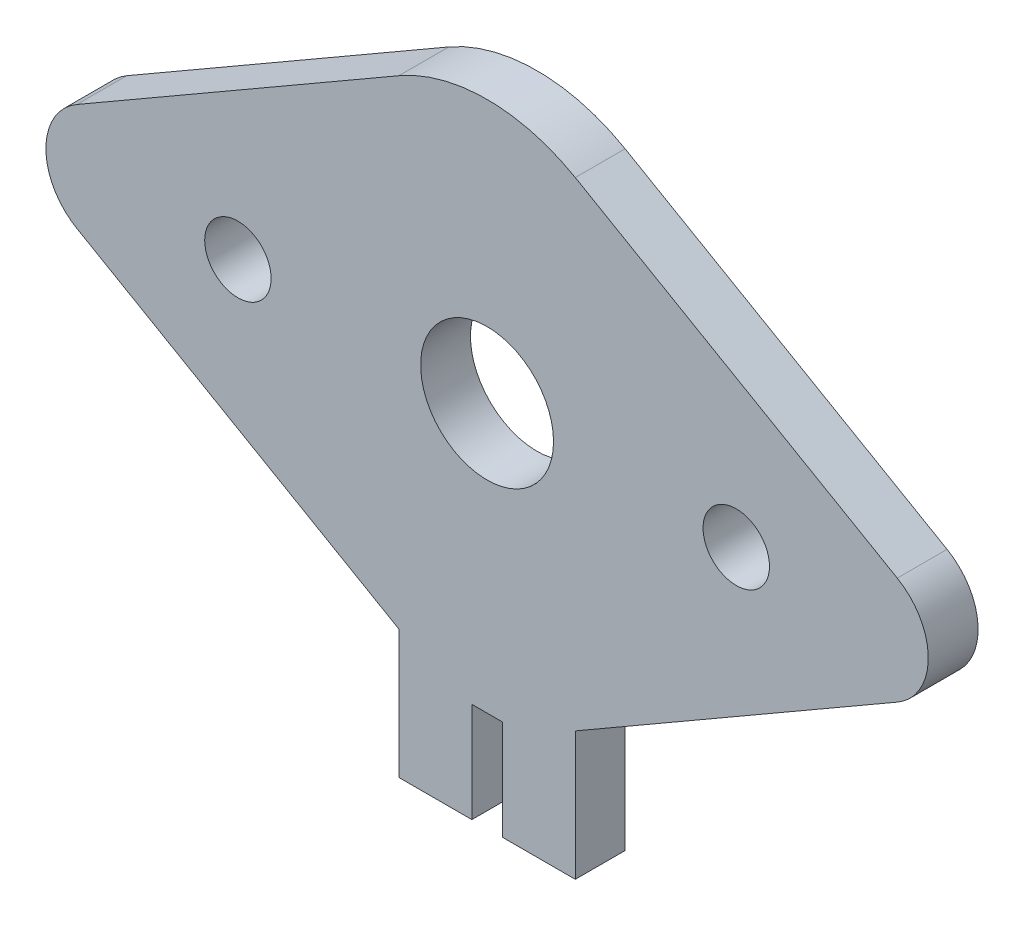
ISO-10303-21;
HEADER;
FILE_DESCRIPTION(('STEP AP214'),'2;1');
FILE_NAME('part.step','',(''),(''),'','','');
FILE_SCHEMA(('AUTOMOTIVE_DESIGN { 1 0 10303 214 1 1 1 1 }'));
ENDSEC;
DATA;
#1=APPLICATION_CONTEXT('core data for automotive mechanical design processes');
#2=APPLICATION_PROTOCOL_DEFINITION('international standard','automotive_design',2000,#1);
#3=PRODUCT_CONTEXT('',#1,'mechanical');
#4=PRODUCT('Part','Part','',(#3));
#5=PRODUCT_RELATED_PRODUCT_CATEGORY('part','',(#4));
#6=PRODUCT_DEFINITION_FORMATION('','',#4);
#7=PRODUCT_DEFINITION_CONTEXT('part definition',#1,'design');
#8=PRODUCT_DEFINITION('design','',#6,#7);
#9=PRODUCT_DEFINITION_SHAPE('','',#8);
#10=(LENGTH_UNIT() NAMED_UNIT(*) SI_UNIT(.MILLI.,.METRE.));
#11=(NAMED_UNIT(*) PLANE_ANGLE_UNIT() SI_UNIT($,.RADIAN.));
#12=(NAMED_UNIT(*) SI_UNIT($,.STERADIAN.) SOLID_ANGLE_UNIT());
#13=UNCERTAINTY_MEASURE_WITH_UNIT(LENGTH_MEASURE(1.E-05),#10,'distance_accuracy_value','');
#14=(GEOMETRIC_REPRESENTATION_CONTEXT(3) GLOBAL_UNCERTAINTY_ASSIGNED_CONTEXT((#13)) GLOBAL_UNIT_ASSIGNED_CONTEXT((#10,
#11,#12)) REPRESENTATION_CONTEXT('',''));
#15=CARTESIAN_POINT('',(0.,0.,0.));
#16=DIRECTION('',(0.,0.,1.));
#17=DIRECTION('',(1.,0.,0.));
#18=AXIS2_PLACEMENT_3D('',#15,#16,#17);
#19=CARTESIAN_POINT('',(3.49113099540332E-12,5.22821843689879,3.));
#20=DIRECTION('',(0.,0.,-1.));
#21=DIRECTION('',(-1.,0.,0.));
#22=AXIS2_PLACEMENT_3D('',#19,#20,#21);
#23=PLANE('',#22);
#24=CARTESIAN_POINT('',(-15.,0.,3.));
#25=DIRECTION('',(0.,0.,-1.));
#26=DIRECTION('',(-1.,0.,0.));
#27=AXIS2_PLACEMENT_3D('',#24,#25,#26);
#28=CIRCLE('',#27,2.00000000000001);
#29=CARTESIAN_POINT('',(-17.,0.,3.));
#30=VERTEX_POINT('',#29);
#31=EDGE_CURVE('E309',#30,#30,#28,.T.);
#32=ORIENTED_EDGE('',*,*,#31,.T.);
#33=EDGE_LOOP('',(#32));
#34=FACE_BOUND('',#33,.T.);
#35=CARTESIAN_POINT('',(3.49113099540332E-12,5.22821843689879,3.));
#36=DIRECTION('',(0.,0.,-1.));
#37=DIRECTION('',(-1.,0.,0.));
#38=AXIS2_PLACEMENT_3D('',#35,#36,#37);
#39=CIRCLE('',#38,10.6185335114162);
#40=CARTESIAN_POINT('',(-5.30926675570459,14.4241382087216,3.));
#41=VERTEX_POINT('',#40);
#42=CARTESIAN_POINT('',(5.30926675571157,14.4241382087216,3.));
#43=VERTEX_POINT('',#42);
#44=EDGE_CURVE('E339',#41,#43,#39,.T.);
#45=ORIENTED_EDGE('',*,*,#44,.F.);
#46=DIRECTION('',(-0.866025403784438,-0.500000000000001,0.));
#47=VECTOR('',#46,1.);
#48=CARTESIAN_POINT('',(-5.30926675570459,14.4241382087216,3.));
#49=LINE('',#48,#47);
#50=CARTESIAN_POINT('',(-24.6931145790386,3.2328684499889,3.));
#51=VERTEX_POINT('',#50);
#52=EDGE_CURVE('E283',#41,#51,#49,.T.);
#53=ORIENTED_EDGE('',*,*,#52,.T.);
#54=CARTESIAN_POINT('',(-22.8266171091828,0.,3.));
#55=DIRECTION('',(0.,0.,1.));
#56=DIRECTION('',(1.,0.,0.));
#57=AXIS2_PLACEMENT_3D('',#54,#55,#56);
#58=CIRCLE('',#57,3.73299493971148);
#59=CARTESIAN_POINT('',(-24.6931145790386,-3.2328684499889,3.));
#60=VERTEX_POINT('',#59);
#61=EDGE_CURVE('E277',#51,#60,#58,.T.);
#62=ORIENTED_EDGE('',*,*,#61,.T.);
#63=DIRECTION('',(-0.866025403784438,0.500000000000001,0.));
#64=VECTOR('',#63,1.);
#65=CARTESIAN_POINT('',(-5.30926675570459,-14.4241382087216,3.));
#66=LINE('',#65,#64);
#67=CARTESIAN_POINT('',(-5.30926675570459,-14.4241382087216,3.));
#68=VERTEX_POINT('',#67);
#69=EDGE_CURVE('E282',#68,#60,#66,.T.);
#70=ORIENTED_EDGE('',*,*,#69,.F.);
#71=DIRECTION('',(0.,-1.,0.));
#72=VECTOR('',#71,1.);
#73=CARTESIAN_POINT('',(-5.30926675570459,-14.4241382087216,3.));
#74=LINE('',#73,#72);
#75=CARTESIAN_POINT('',(-5.30926675570459,-22.1621231765141,3.));
#76=VERTEX_POINT('',#75);
#77=EDGE_CURVE('E298',#68,#76,#74,.T.);
#78=ORIENTED_EDGE('',*,*,#77,.T.);
#79=DIRECTION('',(1.,0.,0.));
#80=VECTOR('',#79,1.);
#81=CARTESIAN_POINT('',(-5.30926675570459,-22.1621231765141,3.));
#82=LINE('',#81,#80);
#83=CARTESIAN_POINT('',(-0.916263641319623,-22.1621231765141,3.));
#84=VERTEX_POINT('',#83);
#85=EDGE_CURVE('E300',#76,#84,#82,.T.);
#86=ORIENTED_EDGE('',*,*,#85,.T.);
#87=DIRECTION('',(0.,1.,0.));
#88=VECTOR('',#87,1.);
#89=CARTESIAN_POINT('',(-0.916263641319623,-22.1621231765141,3.));
#90=LINE('',#89,#88);
#91=CARTESIAN_POINT('',(-0.916263641319623,-16.1507515593028,3.));
#92=VERTEX_POINT('',#91);
#93=EDGE_CURVE('E378',#84,#92,#90,.T.);
#94=ORIENTED_EDGE('',*,*,#93,.T.);
#95=DIRECTION('',(1.,0.,0.));
#96=VECTOR('',#95,1.);
#97=CARTESIAN_POINT('',(-0.916263641319623,-16.1507515593028,3.));
#98=LINE('',#97,#96);
#99=CARTESIAN_POINT('',(0.916263641326606,-16.1507515593028,3.));
#100=VERTEX_POINT('',#99);
#101=EDGE_CURVE('E379',#92,#100,#98,.T.);
#102=ORIENTED_EDGE('',*,*,#101,.T.);
#103=DIRECTION('',(0.,1.,0.));
#104=VECTOR('',#103,1.);
#105=CARTESIAN_POINT('',(0.916263641326606,-22.1621231765141,3.));
#106=LINE('',#105,#104);
#107=CARTESIAN_POINT('',(0.916263641326606,-22.1621231765141,3.));
#108=VERTEX_POINT('',#107);
#109=EDGE_CURVE('E383',#108,#100,#106,.T.);
#110=ORIENTED_EDGE('',*,*,#109,.F.);
#111=DIRECTION('',(-1.,0.,0.));
#112=VECTOR('',#111,1.);
#113=CARTESIAN_POINT('',(5.30926675571157,-22.1621231765141,3.));
#114=LINE('',#113,#112);
#115=CARTESIAN_POINT('',(5.30926675571157,-22.1621231765141,3.));
#116=VERTEX_POINT('',#115);
#117=EDGE_CURVE('E386',#116,#108,#114,.T.);
#118=ORIENTED_EDGE('',*,*,#117,.F.);
#119=DIRECTION('',(0.,-1.,0.));
#120=VECTOR('',#119,1.);
#121=CARTESIAN_POINT('',(5.30926675571157,-14.4241382087216,3.));
#122=LINE('',#121,#120);
#123=CARTESIAN_POINT('',(5.30926675571157,-14.4241382087216,3.));
#124=VERTEX_POINT('',#123);
#125=EDGE_CURVE('E389',#124,#116,#122,.T.);
#126=ORIENTED_EDGE('',*,*,#125,.F.);
#127=DIRECTION('',(0.86602540378436,0.500000000000137,0.));
#128=VECTOR('',#127,1.);
#129=CARTESIAN_POINT('',(5.30926675571157,-14.4241382087216,3.));
#130=LINE('',#129,#128);
#131=CARTESIAN_POINT('',(24.6931145790386,-3.2328684499889,3.));
#132=VERTEX_POINT('',#131);
#133=EDGE_CURVE('E392',#124,#132,#130,.T.);
#134=ORIENTED_EDGE('',*,*,#133,.T.);
#135=CARTESIAN_POINT('',(22.8266171091828,0.,3.));
#136=DIRECTION('',(0.,0.,-1.));
#137=DIRECTION('',(-1.,0.,0.));
#138=AXIS2_PLACEMENT_3D('',#135,#136,#137);
#139=CIRCLE('',#138,3.73299493971148);
#140=CARTESIAN_POINT('',(24.6931145790386,3.2328684499889,3.));
#141=VERTEX_POINT('',#140);
#142=EDGE_CURVE('E394',#141,#132,#139,.T.);
#143=ORIENTED_EDGE('',*,*,#142,.F.);
#144=DIRECTION('',(0.86602540378436,-0.500000000000137,0.));
#145=VECTOR('',#144,1.);
#146=CARTESIAN_POINT('',(5.30926675571157,14.4241382087216,3.));
#147=LINE('',#146,#145);
#148=EDGE_CURVE('E397',#43,#141,#147,.T.);
#149=ORIENTED_EDGE('',*,*,#148,.F.);
#150=EDGE_LOOP('',(#45,#53,#62,#70,#78,#86,#94,#102,#110,#118,#126,#134,#143,#149));
#151=FACE_BOUND('',#150,.T.);
#152=CARTESIAN_POINT('',(0.,0.,3.));
#153=DIRECTION('',(0.,0.,1.));
#154=DIRECTION('',(1.,0.,0.));
#155=AXIS2_PLACEMENT_3D('',#152,#153,#154);
#156=CIRCLE('',#155,4.);
#157=CARTESIAN_POINT('',(4.,0.,3.));
#158=VERTEX_POINT('',#157);
#159=EDGE_CURVE('E403',#158,#158,#156,.T.);
#160=ORIENTED_EDGE('',*,*,#159,.F.);
#161=EDGE_LOOP('',(#160));
#162=FACE_BOUND('',#161,.T.);
#163=CARTESIAN_POINT('',(15.,0.,3.));
#164=DIRECTION('',(0.,0.,1.));
#165=DIRECTION('',(1.,0.,0.));
#166=AXIS2_PLACEMENT_3D('',#163,#164,#165);
#167=CIRCLE('',#166,2.);
#168=CARTESIAN_POINT('',(17.,0.,3.));
#169=VERTEX_POINT('',#168);
#170=EDGE_CURVE('E409',#169,#169,#167,.T.);
#171=ORIENTED_EDGE('',*,*,#170,.F.);
#172=EDGE_LOOP('',(#171));
#173=FACE_BOUND('',#172,.T.);
#174=ADVANCED_FACE('F170',(#34,#151,#162,#173),#23,.F.);
#175=CARTESIAN_POINT('',(3.49113099540332E-12,5.22821843689879,0.));
#176=DIRECTION('',(0.,0.,-1.));
#177=DIRECTION('',(-1.,0.,0.));
#178=AXIS2_PLACEMENT_3D('',#175,#176,#177);
#179=PLANE('',#178);
#180=CARTESIAN_POINT('',(0.,0.,0.));
#181=DIRECTION('',(0.,0.,1.));
#182=DIRECTION('',(1.,0.,0.));
#183=AXIS2_PLACEMENT_3D('',#180,#181,#182);
#184=CIRCLE('',#183,4.);
#185=CARTESIAN_POINT('',(4.,0.,0.));
#186=VERTEX_POINT('',#185);
#187=EDGE_CURVE('E406',#186,#186,#184,.T.);
#188=ORIENTED_EDGE('',*,*,#187,.T.);
#189=EDGE_LOOP('',(#188));
#190=FACE_BOUND('',#189,.T.);
#191=CARTESIAN_POINT('',(-15.,0.,0.));
#192=DIRECTION('',(0.,0.,-1.));
#193=DIRECTION('',(-1.,0.,0.));
#194=AXIS2_PLACEMENT_3D('',#191,#192,#193);
#195=CIRCLE('',#194,2.00000000000001);
#196=CARTESIAN_POINT('',(-17.,0.,0.));
#197=VERTEX_POINT('',#196);
#198=EDGE_CURVE('E400',#197,#197,#195,.T.);
#199=ORIENTED_EDGE('',*,*,#198,.F.);
#200=EDGE_LOOP('',(#199));
#201=FACE_BOUND('',#200,.T.);
#202=CARTESIAN_POINT('',(3.49113099540332E-12,5.22821843689879,0.));
#203=DIRECTION('',(0.,0.,-1.));
#204=DIRECTION('',(-1.,0.,0.));
#205=AXIS2_PLACEMENT_3D('',#202,#203,#204);
#206=CIRCLE('',#205,10.6185335114162);
#207=CARTESIAN_POINT('',(-5.30926675570459,14.4241382087216,0.));
#208=VERTEX_POINT('',#207);
#209=CARTESIAN_POINT('',(5.30926675571157,14.4241382087216,0.));
#210=VERTEX_POINT('',#209);
#211=EDGE_CURVE('E305',#208,#210,#206,.T.);
#212=ORIENTED_EDGE('',*,*,#211,.T.);
#213=DIRECTION('',(0.86602540378436,-0.500000000000137,0.));
#214=VECTOR('',#213,1.);
#215=CARTESIAN_POINT('',(5.30926675571157,14.4241382087216,0.));
#216=LINE('',#215,#214);
#217=CARTESIAN_POINT('',(24.6931145790386,3.2328684499889,0.));
#218=VERTEX_POINT('',#217);
#219=EDGE_CURVE('E308',#210,#218,#216,.T.);
#220=ORIENTED_EDGE('',*,*,#219,.T.);
#221=CARTESIAN_POINT('',(22.8266171091828,0.,0.));
#222=DIRECTION('',(0.,0.,-1.));
#223=DIRECTION('',(-1.,0.,0.));
#224=AXIS2_PLACEMENT_3D('',#221,#222,#223);
#225=CIRCLE('',#224,3.73299493971148);
#226=CARTESIAN_POINT('',(24.6931145790386,-3.2328684499889,0.));
#227=VERTEX_POINT('',#226);
#228=EDGE_CURVE('E312',#218,#227,#225,.T.);
#229=ORIENTED_EDGE('',*,*,#228,.T.);
#230=DIRECTION('',(0.86602540378436,0.500000000000137,0.));
#231=VECTOR('',#230,1.);
#232=CARTESIAN_POINT('',(5.30926675571157,-14.4241382087216,0.));
#233=LINE('',#232,#231);
#234=CARTESIAN_POINT('',(5.30926675571157,-14.4241382087216,0.));
#235=VERTEX_POINT('',#234);
#236=EDGE_CURVE('E315',#235,#227,#233,.T.);
#237=ORIENTED_EDGE('',*,*,#236,.F.);
#238=DIRECTION('',(0.,-1.,0.));
#239=VECTOR('',#238,1.);
#240=CARTESIAN_POINT('',(5.30926675571157,-14.4241382087216,0.));
#241=LINE('',#240,#239);
#242=CARTESIAN_POINT('',(5.30926675571157,-22.1621231765141,0.));
#243=VERTEX_POINT('',#242);
#244=EDGE_CURVE('E318',#235,#243,#241,.T.);
#245=ORIENTED_EDGE('',*,*,#244,.T.);
#246=DIRECTION('',(-1.,0.,0.));
#247=VECTOR('',#246,1.);
#248=CARTESIAN_POINT('',(5.30926675571157,-22.1621231765141,0.));
#249=LINE('',#248,#247);
#250=CARTESIAN_POINT('',(0.916263641326606,-22.1621231765141,0.));
#251=VERTEX_POINT('',#250);
#252=EDGE_CURVE('E321',#243,#251,#249,.T.);
#253=ORIENTED_EDGE('',*,*,#252,.T.);
#254=DIRECTION('',(0.,1.,0.));
#255=VECTOR('',#254,1.);
#256=CARTESIAN_POINT('',(0.916263641326606,-22.1621231765141,0.));
#257=LINE('',#256,#255);
#258=CARTESIAN_POINT('',(0.916263641326606,-16.1507515593028,0.));
#259=VERTEX_POINT('',#258);
#260=EDGE_CURVE('E324',#251,#259,#257,.T.);
#261=ORIENTED_EDGE('',*,*,#260,.T.);
#262=DIRECTION('',(1.,0.,0.));
#263=VECTOR('',#262,1.);
#264=CARTESIAN_POINT('',(-0.916263641319623,-16.1507515593028,0.));
#265=LINE('',#264,#263);
#266=CARTESIAN_POINT('',(-0.916263641319623,-16.1507515593028,0.));
#267=VERTEX_POINT('',#266);
#268=EDGE_CURVE('E327',#267,#259,#265,.T.);
#269=ORIENTED_EDGE('',*,*,#268,.F.);
#270=DIRECTION('',(0.,1.,0.));
#271=VECTOR('',#270,1.);
#272=CARTESIAN_POINT('',(-0.916263641319623,-22.1621231765141,0.));
#273=LINE('',#272,#271);
#274=CARTESIAN_POINT('',(-0.916263641319623,-22.1621231765141,0.));
#275=VERTEX_POINT('',#274);
#276=EDGE_CURVE('E330',#275,#267,#273,.T.);
#277=ORIENTED_EDGE('',*,*,#276,.F.);
#278=DIRECTION('',(1.,0.,0.));
#279=VECTOR('',#278,1.);
#280=CARTESIAN_POINT('',(-5.30926675570459,-22.1621231765141,0.));
#281=LINE('',#280,#279);
#282=CARTESIAN_POINT('',(-5.30926675570459,-22.1621231765141,0.));
#283=VERTEX_POINT('',#282);
#284=EDGE_CURVE('E332',#283,#275,#281,.T.);
#285=ORIENTED_EDGE('',*,*,#284,.F.);
#286=DIRECTION('',(0.,-1.,0.));
#287=VECTOR('',#286,1.);
#288=CARTESIAN_POINT('',(-5.30926675570459,-14.4241382087216,0.));
#289=LINE('',#288,#287);
#290=CARTESIAN_POINT('',(-5.30926675570459,-14.4241382087216,0.));
#291=VERTEX_POINT('',#290);
#292=EDGE_CURVE('E334',#291,#283,#289,.T.);
#293=ORIENTED_EDGE('',*,*,#292,.F.);
#294=DIRECTION('',(-0.866025403784438,0.500000000000001,0.));
#295=VECTOR('',#294,1.);
#296=CARTESIAN_POINT('',(-5.30926675570459,-14.4241382087216,0.));
#297=LINE('',#296,#295);
#298=CARTESIAN_POINT('',(-24.6931145790386,-3.2328684499889,0.));
#299=VERTEX_POINT('',#298);
#300=EDGE_CURVE('E336',#291,#299,#297,.T.);
#301=ORIENTED_EDGE('',*,*,#300,.T.);
#302=CARTESIAN_POINT('',(-22.8266171091828,0.,0.));
#303=DIRECTION('',(0.,0.,1.));
#304=DIRECTION('',(1.,0.,0.));
#305=AXIS2_PLACEMENT_3D('',#302,#303,#304);
#306=CIRCLE('',#305,3.73299493971148);
#307=CARTESIAN_POINT('',(-24.6931145790386,3.2328684499889,0.));
#308=VERTEX_POINT('',#307);
#309=EDGE_CURVE('E290',#308,#299,#306,.T.);
#310=ORIENTED_EDGE('',*,*,#309,.F.);
#311=DIRECTION('',(-0.866025403784438,-0.500000000000001,0.));
#312=VECTOR('',#311,1.);
#313=CARTESIAN_POINT('',(-5.30926675570459,14.4241382087216,0.));
#314=LINE('',#313,#312);
#315=EDGE_CURVE('E234',#208,#308,#314,.T.);
#316=ORIENTED_EDGE('',*,*,#315,.F.);
#317=EDGE_LOOP('',(#212,#220,#229,#237,#245,#253,#261,#269,#277,#285,#293,#301,#310,#316));
#318=FACE_BOUND('',#317,.T.);
#319=CARTESIAN_POINT('',(15.,0.,0.));
#320=DIRECTION('',(0.,0.,1.));
#321=DIRECTION('',(1.,0.,0.));
#322=AXIS2_PLACEMENT_3D('',#319,#320,#321);
#323=CIRCLE('',#322,2.);
#324=CARTESIAN_POINT('',(17.,0.,0.));
#325=VERTEX_POINT('',#324);
#326=EDGE_CURVE('E412',#325,#325,#323,.T.);
#327=ORIENTED_EDGE('',*,*,#326,.T.);
#328=EDGE_LOOP('',(#327));
#329=FACE_BOUND('',#328,.T.);
#330=ADVANCED_FACE('F365',(#190,#201,#318,#329),#179,.T.);
#331=CARTESIAN_POINT('',(3.49113099540332E-12,5.22821843689879,3.));
#332=DIRECTION('',(0.,0.,-1.));
#333=DIRECTION('',(-1.,0.,0.));
#334=AXIS2_PLACEMENT_3D('',#331,#332,#333);
#335=CYLINDRICAL_SURFACE('',#334,10.6185335114162);
#336=ORIENTED_EDGE('',*,*,#211,.F.);
#337=DIRECTION('',(0.,0.,-1.));
#338=VECTOR('',#337,1.);
#339=CARTESIAN_POINT('',(-5.30926675570459,14.4241382087216,3.));
#340=LINE('',#339,#338);
#341=EDGE_CURVE('E12',#41,#208,#340,.T.);
#342=ORIENTED_EDGE('',*,*,#341,.F.);
#343=ORIENTED_EDGE('',*,*,#44,.T.);
#344=DIRECTION('',(0.,0.,-1.));
#345=VECTOR('',#344,1.);
#346=CARTESIAN_POINT('',(5.30926675571157,14.4241382087216,3.));
#347=LINE('',#346,#345);
#348=EDGE_CURVE('E174',#43,#210,#347,.T.);
#349=ORIENTED_EDGE('',*,*,#348,.T.);
#350=EDGE_LOOP('',(#336,#342,#343,#349));
#351=FACE_BOUND('',#350,.T.);
#352=ADVANCED_FACE('F172',(#351),#335,.T.);
#353=CARTESIAN_POINT('',(-5.30926675570459,14.4241382087216,3.));
#354=DIRECTION('',(0.500000000000001,-0.866025403784438,0.));
#355=DIRECTION('',(0.866025403784438,0.500000000000001,0.));
#356=AXIS2_PLACEMENT_3D('',#353,#354,#355);
#357=PLANE('',#356);
#358=ORIENTED_EDGE('',*,*,#315,.T.);
#359=DIRECTION('',(0.,0.,-1.));
#360=VECTOR('',#359,1.);
#361=CARTESIAN_POINT('',(-24.6931145790386,3.2328684499889,3.));
#362=LINE('',#361,#360);
#363=EDGE_CURVE('E180',#51,#308,#362,.T.);
#364=ORIENTED_EDGE('',*,*,#363,.F.);
#365=ORIENTED_EDGE('',*,*,#52,.F.);
#366=ORIENTED_EDGE('',*,*,#341,.T.);
#367=EDGE_LOOP('',(#358,#364,#365,#366));
#368=FACE_BOUND('',#367,.T.);
#369=ADVANCED_FACE('F433',(#368),#357,.F.);
#370=CARTESIAN_POINT('',(-22.8266171091828,0.,3.));
#371=DIRECTION('',(0.,0.,-1.));
#372=DIRECTION('',(-1.,0.,0.));
#373=AXIS2_PLACEMENT_3D('',#370,#371,#372);
#374=CYLINDRICAL_SURFACE('',#373,3.73299493971148);
#375=ORIENTED_EDGE('',*,*,#309,.T.);
#376=DIRECTION('',(0.,0.,-1.));
#377=VECTOR('',#376,1.);
#378=CARTESIAN_POINT('',(-24.6931145790386,-3.2328684499889,3.));
#379=LINE('',#378,#377);
#380=EDGE_CURVE('E287',#60,#299,#379,.T.);
#381=ORIENTED_EDGE('',*,*,#380,.F.);
#382=ORIENTED_EDGE('',*,*,#61,.F.);
#383=ORIENTED_EDGE('',*,*,#363,.T.);
#384=EDGE_LOOP('',(#375,#381,#382,#383));
#385=FACE_BOUND('',#384,.T.);
#386=ADVANCED_FACE('F288',(#385),#374,.T.);
#387=CARTESIAN_POINT('',(-5.30926675570459,-14.4241382087216,3.));
#388=DIRECTION('',(-0.500000000000001,-0.866025403784438,0.));
#389=DIRECTION('',(0.866025403784438,-0.500000000000001,0.));
#390=AXIS2_PLACEMENT_3D('',#387,#388,#389);
#391=PLANE('',#390);
#392=ORIENTED_EDGE('',*,*,#300,.F.);
#393=DIRECTION('',(0.,0.,-1.));
#394=VECTOR('',#393,1.);
#395=CARTESIAN_POINT('',(-5.30926675570459,-14.4241382087216,3.));
#396=LINE('',#395,#394);
#397=EDGE_CURVE('E294',#68,#291,#396,.T.);
#398=ORIENTED_EDGE('',*,*,#397,.F.);
#399=ORIENTED_EDGE('',*,*,#69,.T.);
#400=ORIENTED_EDGE('',*,*,#380,.T.);
#401=EDGE_LOOP('',(#392,#398,#399,#400));
#402=FACE_BOUND('',#401,.T.);
#403=ADVANCED_FACE('F296',(#402),#391,.T.);
#404=CARTESIAN_POINT('',(-5.30926675570459,-14.4241382087216,3.));
#405=DIRECTION('',(1.,0.,0.));
#406=DIRECTION('',(0.,1.,0.));
#407=AXIS2_PLACEMENT_3D('',#404,#405,#406);
#408=PLANE('',#407);
#409=ORIENTED_EDGE('',*,*,#292,.T.);
#410=DIRECTION('',(0.,0.,-1.));
#411=VECTOR('',#410,1.);
#412=CARTESIAN_POINT('',(-5.30926675570459,-22.1621231765141,3.));
#413=LINE('',#412,#411);
#414=EDGE_CURVE('E343',#76,#283,#413,.T.);
#415=ORIENTED_EDGE('',*,*,#414,.F.);
#416=ORIENTED_EDGE('',*,*,#77,.F.);
#417=ORIENTED_EDGE('',*,*,#397,.T.);
#418=EDGE_LOOP('',(#409,#415,#416,#417));
#419=FACE_BOUND('',#418,.T.);
#420=ADVANCED_FACE('F372',(#419),#408,.F.);
#421=CARTESIAN_POINT('',(-5.30926675570459,-22.1621231765141,3.));
#422=DIRECTION('',(0.,1.,0.));
#423=DIRECTION('',(0.,0.,1.));
#424=AXIS2_PLACEMENT_3D('',#421,#422,#423);
#425=PLANE('',#424);
#426=ORIENTED_EDGE('',*,*,#284,.T.);
#427=DIRECTION('',(0.,0.,-1.));
#428=VECTOR('',#427,1.);
#429=CARTESIAN_POINT('',(-0.916263641319623,-22.1621231765141,3.));
#430=LINE('',#429,#428);
#431=EDGE_CURVE('E346',#84,#275,#430,.T.);
#432=ORIENTED_EDGE('',*,*,#431,.F.);
#433=ORIENTED_EDGE('',*,*,#85,.F.);
#434=ORIENTED_EDGE('',*,*,#414,.T.);
#435=EDGE_LOOP('',(#426,#432,#433,#434));
#436=FACE_BOUND('',#435,.T.);
#437=ADVANCED_FACE('F375',(#436),#425,.F.);
#438=CARTESIAN_POINT('',(-0.916263641319623,-22.1621231765141,3.));
#439=DIRECTION('',(-1.,0.,0.));
#440=DIRECTION('',(0.,0.,1.));
#441=AXIS2_PLACEMENT_3D('',#438,#439,#440);
#442=PLANE('',#441);
#443=ORIENTED_EDGE('',*,*,#276,.T.);
#444=DIRECTION('',(0.,0.,-1.));
#445=VECTOR('',#444,1.);
#446=CARTESIAN_POINT('',(-0.916263641319623,-16.1507515593028,3.));
#447=LINE('',#446,#445);
#448=EDGE_CURVE('E349',#92,#267,#447,.T.);
#449=ORIENTED_EDGE('',*,*,#448,.F.);
#450=ORIENTED_EDGE('',*,*,#93,.F.);
#451=ORIENTED_EDGE('',*,*,#431,.T.);
#452=EDGE_LOOP('',(#443,#449,#450,#451));
#453=FACE_BOUND('',#452,.T.);
#454=ADVANCED_FACE('F444',(#453),#442,.F.);
#455=CARTESIAN_POINT('',(-0.916263641319623,-16.1507515593028,3.));
#456=DIRECTION('',(0.,1.,0.));
#457=DIRECTION('',(0.,0.,1.));
#458=AXIS2_PLACEMENT_3D('',#455,#456,#457);
#459=PLANE('',#458);
#460=ORIENTED_EDGE('',*,*,#268,.T.);
#461=DIRECTION('',(0.,0.,-1.));
#462=VECTOR('',#461,1.);
#463=CARTESIAN_POINT('',(0.916263641326606,-16.1507515593028,3.));
#464=LINE('',#463,#462);
#465=EDGE_CURVE('E352',#100,#259,#464,.T.);
#466=ORIENTED_EDGE('',*,*,#465,.F.);
#467=ORIENTED_EDGE('',*,*,#101,.F.);
#468=ORIENTED_EDGE('',*,*,#448,.T.);
#469=EDGE_LOOP('',(#460,#466,#467,#468));
#470=FACE_BOUND('',#469,.T.);
#471=ADVANCED_FACE('F447',(#470),#459,.F.);
#472=CARTESIAN_POINT('',(0.916263641326606,-22.1621231765141,3.));
#473=DIRECTION('',(-1.,0.,0.));
#474=DIRECTION('',(0.,0.,1.));
#475=AXIS2_PLACEMENT_3D('',#472,#473,#474);
#476=PLANE('',#475);
#477=ORIENTED_EDGE('',*,*,#260,.F.);
#478=DIRECTION('',(0.,0.,-1.));
#479=VECTOR('',#478,1.);
#480=CARTESIAN_POINT('',(0.916263641326606,-22.1621231765141,3.));
#481=LINE('',#480,#479);
#482=EDGE_CURVE('E354',#108,#251,#481,.T.);
#483=ORIENTED_EDGE('',*,*,#482,.F.);
#484=ORIENTED_EDGE('',*,*,#109,.T.);
#485=ORIENTED_EDGE('',*,*,#465,.T.);
#486=EDGE_LOOP('',(#477,#483,#484,#485));
#487=FACE_BOUND('',#486,.T.);
#488=ADVANCED_FACE('F451',(#487),#476,.T.);
#489=CARTESIAN_POINT('',(5.30926675571157,-22.1621231765141,3.));
#490=DIRECTION('',(0.,-1.,0.));
#491=DIRECTION('',(0.,0.,-1.));
#492=AXIS2_PLACEMENT_3D('',#489,#490,#491);
#493=PLANE('',#492);
#494=ORIENTED_EDGE('',*,*,#252,.F.);
#495=DIRECTION('',(0.,0.,-1.));
#496=VECTOR('',#495,1.);
#497=CARTESIAN_POINT('',(5.30926675571157,-22.1621231765141,3.));
#498=LINE('',#497,#496);
#499=EDGE_CURVE('E356',#116,#243,#498,.T.);
#500=ORIENTED_EDGE('',*,*,#499,.F.);
#501=ORIENTED_EDGE('',*,*,#117,.T.);
#502=ORIENTED_EDGE('',*,*,#482,.T.);
#503=EDGE_LOOP('',(#494,#500,#501,#502));
#504=FACE_BOUND('',#503,.T.);
#505=ADVANCED_FACE('F455',(#504),#493,.T.);
#506=CARTESIAN_POINT('',(5.30926675571157,-14.4241382087216,3.));
#507=DIRECTION('',(1.,0.,0.));
#508=DIRECTION('',(0.,1.,0.));
#509=AXIS2_PLACEMENT_3D('',#506,#507,#508);
#510=PLANE('',#509);
#511=ORIENTED_EDGE('',*,*,#244,.F.);
#512=DIRECTION('',(0.,0.,-1.));
#513=VECTOR('',#512,1.);
#514=CARTESIAN_POINT('',(5.30926675571157,-14.4241382087216,3.));
#515=LINE('',#514,#513);
#516=EDGE_CURVE('E358',#124,#235,#515,.T.);
#517=ORIENTED_EDGE('',*,*,#516,.F.);
#518=ORIENTED_EDGE('',*,*,#125,.T.);
#519=ORIENTED_EDGE('',*,*,#499,.T.);
#520=EDGE_LOOP('',(#511,#517,#518,#519));
#521=FACE_BOUND('',#520,.T.);
#522=ADVANCED_FACE('F459',(#521),#510,.T.);
#523=CARTESIAN_POINT('',(5.30926675571157,-14.4241382087216,3.));
#524=DIRECTION('',(-0.500000000000137,0.86602540378436,0.));
#525=DIRECTION('',(-0.86602540378436,-0.500000000000137,0.));
#526=AXIS2_PLACEMENT_3D('',#523,#524,#525);
#527=PLANE('',#526);
#528=ORIENTED_EDGE('',*,*,#236,.T.);
#529=DIRECTION('',(0.,0.,-1.));
#530=VECTOR('',#529,1.);
#531=CARTESIAN_POINT('',(24.6931145790386,-3.2328684499889,3.));
#532=LINE('',#531,#530);
#533=EDGE_CURVE('E360',#132,#227,#532,.T.);
#534=ORIENTED_EDGE('',*,*,#533,.F.);
#535=ORIENTED_EDGE('',*,*,#133,.F.);
#536=ORIENTED_EDGE('',*,*,#516,.T.);
#537=EDGE_LOOP('',(#528,#534,#535,#536));
#538=FACE_BOUND('',#537,.T.);
#539=ADVANCED_FACE('F463',(#538),#527,.F.);
#540=CARTESIAN_POINT('',(22.8266171091828,0.,3.));
#541=DIRECTION('',(0.,0.,-1.));
#542=DIRECTION('',(-1.,0.,0.));
#543=AXIS2_PLACEMENT_3D('',#540,#541,#542);
#544=CYLINDRICAL_SURFACE('',#543,3.73299493971148);
#545=ORIENTED_EDGE('',*,*,#228,.F.);
#546=DIRECTION('',(0.,0.,-1.));
#547=VECTOR('',#546,1.);
#548=CARTESIAN_POINT('',(24.6931145790386,3.2328684499889,3.));
#549=LINE('',#548,#547);
#550=EDGE_CURVE('E361',#141,#218,#549,.T.);
#551=ORIENTED_EDGE('',*,*,#550,.F.);
#552=ORIENTED_EDGE('',*,*,#142,.T.);
#553=ORIENTED_EDGE('',*,*,#533,.T.);
#554=EDGE_LOOP('',(#545,#551,#552,#553));
#555=FACE_BOUND('',#554,.T.);
#556=ADVANCED_FACE('F467',(#555),#544,.T.);
#557=CARTESIAN_POINT('',(5.30926675571157,14.4241382087216,3.));
#558=DIRECTION('',(0.500000000000137,0.86602540378436,0.));
#559=DIRECTION('',(-0.86602540378436,0.500000000000137,0.));
#560=AXIS2_PLACEMENT_3D('',#557,#558,#559);
#561=PLANE('',#560);
#562=ORIENTED_EDGE('',*,*,#219,.F.);
#563=ORIENTED_EDGE('',*,*,#348,.F.);
#564=ORIENTED_EDGE('',*,*,#148,.T.);
#565=ORIENTED_EDGE('',*,*,#550,.T.);
#566=EDGE_LOOP('',(#562,#563,#564,#565));
#567=FACE_BOUND('',#566,.T.);
#568=ADVANCED_FACE('F363',(#567),#561,.T.);
#569=CARTESIAN_POINT('',(-15.,0.,3.));
#570=DIRECTION('',(0.,0.,-1.));
#571=DIRECTION('',(-1.,0.,0.));
#572=AXIS2_PLACEMENT_3D('',#569,#570,#571);
#573=CYLINDRICAL_SURFACE('',#572,2.00000000000001);
#574=ORIENTED_EDGE('',*,*,#31,.F.);
#575=EDGE_LOOP('',(#574));
#576=FACE_BOUND('',#575,.T.);
#577=ORIENTED_EDGE('',*,*,#198,.T.);
#578=EDGE_LOOP('',(#577));
#579=FACE_BOUND('',#578,.T.);
#580=ADVANCED_FACE('F430',(#576,#579),#573,.F.);
#581=CARTESIAN_POINT('',(0.,0.,3.));
#582=DIRECTION('',(0.,0.,-1.));
#583=DIRECTION('',(-1.,0.,0.));
#584=AXIS2_PLACEMENT_3D('',#581,#582,#583);
#585=CYLINDRICAL_SURFACE('',#584,4.);
#586=ORIENTED_EDGE('',*,*,#159,.T.);
#587=EDGE_LOOP('',(#586));
#588=FACE_BOUND('',#587,.T.);
#589=ORIENTED_EDGE('',*,*,#187,.F.);
#590=EDGE_LOOP('',(#589));
#591=FACE_BOUND('',#590,.T.);
#592=ADVANCED_FACE('F475',(#588,#591),#585,.F.);
#593=CARTESIAN_POINT('',(15.,0.,3.));
#594=DIRECTION('',(0.,0.,-1.));
#595=DIRECTION('',(-1.,0.,0.));
#596=AXIS2_PLACEMENT_3D('',#593,#594,#595);
#597=CYLINDRICAL_SURFACE('',#596,2.);
#598=ORIENTED_EDGE('',*,*,#170,.T.);
#599=EDGE_LOOP('',(#598));
#600=FACE_BOUND('',#599,.T.);
#601=ORIENTED_EDGE('',*,*,#326,.F.);
#602=EDGE_LOOP('',(#601));
#603=FACE_BOUND('',#602,.T.);
#604=ADVANCED_FACE('F418',(#600,#603),#597,.F.);
#605=CLOSED_SHELL('',(#174,#330,#352,#369,#386,#403,#420,#437,#454,#471,#488,#505,#522,#539,
#556,#568,#580,#592,#604));
#606=MANIFOLD_SOLID_BREP('B2',#605);
#607=ADVANCED_BREP_SHAPE_REPRESENTATION('',(#18,#606),#14);
#608=SHAPE_DEFINITION_REPRESENTATION(#9,#607);
ENDSEC;
END-ISO-10303-21;
